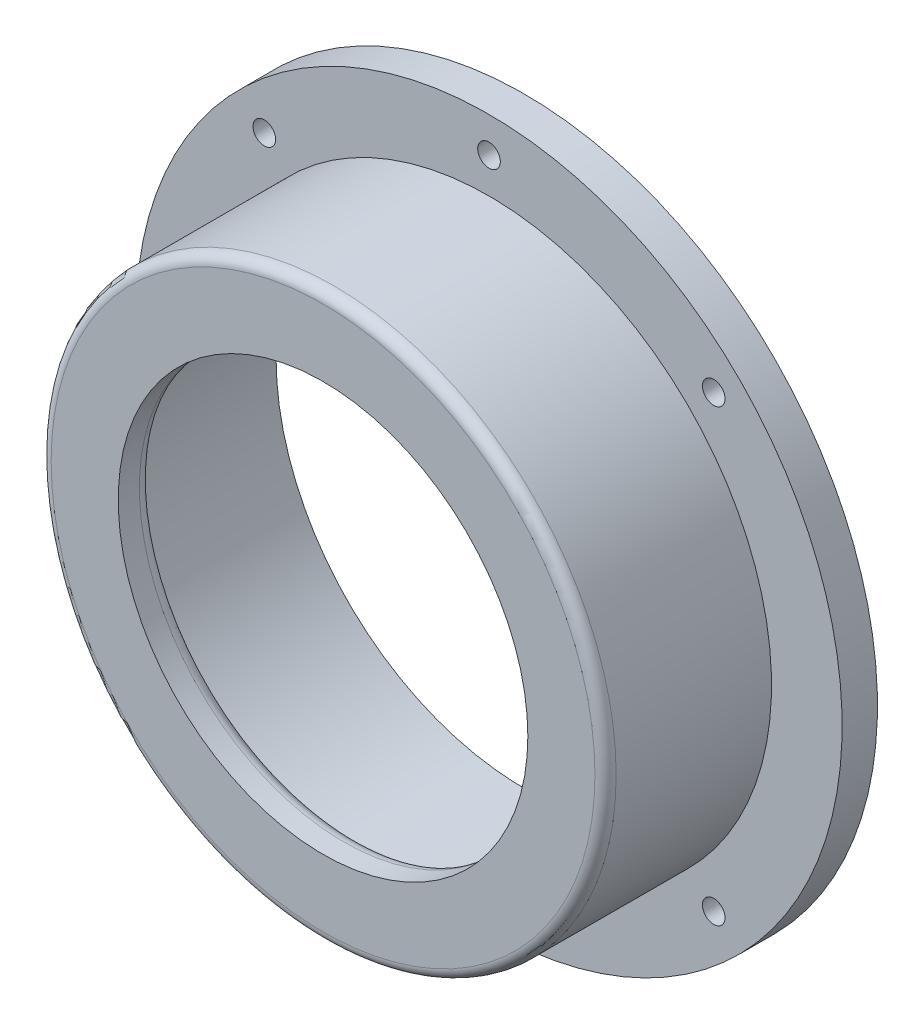
ISO-10303-21;
HEADER;
FILE_DESCRIPTION(('STEP AP214'),'2;1');
FILE_NAME('part.step','',(''),(''),'','','');
FILE_SCHEMA(('AUTOMOTIVE_DESIGN { 1 0 10303 214 1 1 1 1 }'));
ENDSEC;
DATA;
#1=APPLICATION_CONTEXT('core data for automotive mechanical design processes');
#2=APPLICATION_PROTOCOL_DEFINITION('international standard','automotive_design',2000,#1);
#3=PRODUCT_CONTEXT('',#1,'mechanical');
#4=PRODUCT('Part','Part','',(#3));
#5=PRODUCT_RELATED_PRODUCT_CATEGORY('part','',(#4));
#6=PRODUCT_DEFINITION_FORMATION('','',#4);
#7=PRODUCT_DEFINITION_CONTEXT('part definition',#1,'design');
#8=PRODUCT_DEFINITION('design','',#6,#7);
#9=PRODUCT_DEFINITION_SHAPE('','',#8);
#10=(LENGTH_UNIT() NAMED_UNIT(*) SI_UNIT(.MILLI.,.METRE.));
#11=(NAMED_UNIT(*) PLANE_ANGLE_UNIT() SI_UNIT($,.RADIAN.));
#12=(NAMED_UNIT(*) SI_UNIT($,.STERADIAN.) SOLID_ANGLE_UNIT());
#13=UNCERTAINTY_MEASURE_WITH_UNIT(LENGTH_MEASURE(1.E-05),#10,'distance_accuracy_value','');
#14=(GEOMETRIC_REPRESENTATION_CONTEXT(3) GLOBAL_UNCERTAINTY_ASSIGNED_CONTEXT((#13)) GLOBAL_UNIT_ASSIGNED_CONTEXT((#10,
#11,#12)) REPRESENTATION_CONTEXT('',''));
#15=CARTESIAN_POINT('',(0.,0.,0.));
#16=DIRECTION('',(0.,0.,1.));
#17=DIRECTION('',(1.,0.,0.));
#18=AXIS2_PLACEMENT_3D('',#15,#16,#17);
#19=CARTESIAN_POINT('',(0.,0.,28.5));
#20=DIRECTION('',(0.,0.,-1.));
#21=DIRECTION('',(-1.,0.,0.));
#22=AXIS2_PLACEMENT_3D('',#19,#20,#21);
#23=CYLINDRICAL_SURFACE('',#22,40.);
#24=CARTESIAN_POINT('',(0.,0.,27.));
#25=DIRECTION('',(0.,0.,1.));
#26=DIRECTION('',(1.,0.,0.));
#27=AXIS2_PLACEMENT_3D('',#24,#25,#26);
#28=CIRCLE('',#27,40.);
#29=CARTESIAN_POINT('',(-40.,0.,27.));
#30=VERTEX_POINT('',#29);
#31=EDGE_CURVE('E48',#30,#30,#28,.F.);
#32=CARTESIAN_POINT('',(0.,0.,5.));
#33=DIRECTION('',(0.,0.,-1.));
#34=DIRECTION('',(-1.,0.,0.));
#35=AXIS2_PLACEMENT_3D('',#32,#33,#34);
#36=CIRCLE('',#35,40.);
#37=CARTESIAN_POINT('',(-40.,0.,5.));
#38=VERTEX_POINT('',#37);
#39=EDGE_CURVE('E63',#38,#38,#36,.T.);
#40=CARTESIAN_POINT('',(-40.,0.,27.));
#41=CARTESIAN_POINT('',(-40.,0.,26.7708333333333));
#42=CARTESIAN_POINT('',(-40.,0.,26.5416666666667));
#43=CARTESIAN_POINT('',(-40.,0.,26.0833333333333));
#44=CARTESIAN_POINT('',(-40.,0.,25.8541666666667));
#45=CARTESIAN_POINT('',(-40.,0.,25.3958333333333));
#46=CARTESIAN_POINT('',(-40.,0.,25.1666666666667));
#47=CARTESIAN_POINT('',(-40.,0.,24.7083333333333));
#48=CARTESIAN_POINT('',(-40.,0.,24.4791666666667));
#49=CARTESIAN_POINT('',(-40.,0.,24.0208333333333));
#50=CARTESIAN_POINT('',(-40.,0.,23.7916666666667));
#51=CARTESIAN_POINT('',(-40.,0.,23.3333333333333));
#52=CARTESIAN_POINT('',(-40.,0.,23.1041666666667));
#53=CARTESIAN_POINT('',(-40.,0.,22.6458333333333));
#54=CARTESIAN_POINT('',(-40.,0.,22.4166666666667));
#55=CARTESIAN_POINT('',(-40.,0.,21.9583333333333));
#56=CARTESIAN_POINT('',(-40.,0.,21.7291666666667));
#57=CARTESIAN_POINT('',(-40.,0.,21.2708333333333));
#58=CARTESIAN_POINT('',(-40.,0.,21.0416666666667));
#59=CARTESIAN_POINT('',(-40.,0.,20.5833333333333));
#60=CARTESIAN_POINT('',(-40.,0.,20.3541666666667));
#61=CARTESIAN_POINT('',(-40.,0.,19.8958333333333));
#62=CARTESIAN_POINT('',(-40.,0.,19.6666666666667));
#63=CARTESIAN_POINT('',(-40.,0.,19.2083333333333));
#64=CARTESIAN_POINT('',(-40.,0.,18.9791666666667));
#65=CARTESIAN_POINT('',(-40.,0.,18.5208333333333));
#66=CARTESIAN_POINT('',(-40.,0.,18.2916666666667));
#67=CARTESIAN_POINT('',(-40.,0.,17.8333333333333));
#68=CARTESIAN_POINT('',(-40.,0.,17.6041666666667));
#69=CARTESIAN_POINT('',(-40.,0.,17.1458333333333));
#70=CARTESIAN_POINT('',(-40.,0.,16.9166666666667));
#71=CARTESIAN_POINT('',(-40.,0.,16.4583333333333));
#72=CARTESIAN_POINT('',(-40.,0.,16.2291666666667));
#73=CARTESIAN_POINT('',(-40.,0.,15.7708333333333));
#74=CARTESIAN_POINT('',(-40.,0.,15.5416666666667));
#75=CARTESIAN_POINT('',(-40.,0.,15.0833333333333));
#76=CARTESIAN_POINT('',(-40.,0.,14.8541666666667));
#77=CARTESIAN_POINT('',(-40.,0.,14.3958333333333));
#78=CARTESIAN_POINT('',(-40.,0.,14.1666666666667));
#79=CARTESIAN_POINT('',(-40.,0.,13.7083333333333));
#80=CARTESIAN_POINT('',(-40.,0.,13.4791666666667));
#81=CARTESIAN_POINT('',(-40.,0.,13.0208333333333));
#82=CARTESIAN_POINT('',(-40.,0.,12.7916666666667));
#83=CARTESIAN_POINT('',(-40.,0.,12.3333333333333));
#84=CARTESIAN_POINT('',(-40.,0.,12.1041666666667));
#85=CARTESIAN_POINT('',(-40.,0.,11.6458333333333));
#86=CARTESIAN_POINT('',(-40.,0.,11.4166666666667));
#87=CARTESIAN_POINT('',(-40.,0.,10.9583333333333));
#88=CARTESIAN_POINT('',(-40.,0.,10.7291666666667));
#89=CARTESIAN_POINT('',(-40.,0.,10.2708333333333));
#90=CARTESIAN_POINT('',(-40.,0.,10.0416666666667));
#91=CARTESIAN_POINT('',(-40.,0.,9.58333333333333));
#92=CARTESIAN_POINT('',(-40.,0.,9.35416666666667));
#93=CARTESIAN_POINT('',(-40.,0.,8.89583333333333));
#94=CARTESIAN_POINT('',(-40.,0.,8.66666666666667));
#95=CARTESIAN_POINT('',(-40.,0.,8.20833333333333));
#96=CARTESIAN_POINT('',(-40.,0.,7.97916666666667));
#97=CARTESIAN_POINT('',(-40.,0.,7.52083333333333));
#98=CARTESIAN_POINT('',(-40.,0.,7.29166666666667));
#99=CARTESIAN_POINT('',(-40.,0.,6.83333333333333));
#100=CARTESIAN_POINT('',(-40.,0.,6.60416666666667));
#101=CARTESIAN_POINT('',(-40.,0.,6.14583333333334));
#102=CARTESIAN_POINT('',(-40.,0.,5.91666666666667));
#103=CARTESIAN_POINT('',(-40.,0.,5.45833333333334));
#104=CARTESIAN_POINT('',(-40.,0.,5.22916666666667));
#105=CARTESIAN_POINT('',(-40.,0.,5.));
#106=B_SPLINE_CURVE_WITH_KNOTS('',3,(#40,#41,#42,#43,#44,#45,#46,#47,#48,#49,#50,#51,#52,#53,
#54,#55,#56,#57,#58,#59,#60,#61,#62,#63,#64,#65,#66,#67,#68,#69,#70,#71,#72,#73,#74,#75,#76,#77,
#78,#79,#80,#81,#82,#83,#84,#85,#86,#87,#88,#89,#90,#91,#92,#93,#94,#95,#96,#97,#98,#99,#100,
#101,#102,#103,#104,#105),.UNSPECIFIED.,.F.,.F.,(4,2,2,2,2,2,2,2,2,2,2,2,2,2,2,2,2,2,2,2,2,2,2,
2,2,2,2,2,2,2,2,2,4),(0.,0.687500000000001,1.375,2.0625,2.75,3.4375,4.125,4.8125,5.5,6.1875,
6.875,7.5625,8.25,8.9375,9.625,10.3125,11.,11.6875,12.375,13.0625,13.75,14.4375,15.125,15.8125,
16.5,17.1875,17.875,18.5625,19.25,19.9375,20.625,21.3125,22.),.UNSPECIFIED.);
#107=EDGE_CURVE('BSEAM37',#30,#38,#106,.T.);
#108=ORIENTED_EDGE('',*,*,#31,.T.);
#109=ORIENTED_EDGE('',*,*,#39,.F.);
#110=ORIENTED_EDGE('',*,*,#107,.T.);
#111=ORIENTED_EDGE('',*,*,#107,.F.);
#112=EDGE_LOOP('',(#108,#110,#109,#111));
#113=FACE_BOUND('',#112,.T.);
#114=ADVANCED_FACE('F37',(#113),#23,.T.);
#115=CARTESIAN_POINT('',(0.,0.,28.5));
#116=DIRECTION('',(0.,0.,-1.));
#117=DIRECTION('',(-1.,0.,0.));
#118=AXIS2_PLACEMENT_3D('',#115,#116,#117);
#119=CYLINDRICAL_SURFACE('',#118,35.15);
#120=CARTESIAN_POINT('',(0.,0.,22.));
#121=DIRECTION('',(0.,0.,1.));
#122=DIRECTION('',(1.,0.,0.));
#123=AXIS2_PLACEMENT_3D('',#120,#121,#122);
#124=CIRCLE('',#123,35.15);
#125=CARTESIAN_POINT('',(-35.15,0.,22.));
#126=VERTEX_POINT('',#125);
#127=EDGE_CURVE('E60',#126,#126,#124,.T.);
#128=CARTESIAN_POINT('',(0.,0.,0.));
#129=DIRECTION('',(0.,0.,1.));
#130=DIRECTION('',(1.,0.,0.));
#131=AXIS2_PLACEMENT_3D('',#128,#129,#130);
#132=CIRCLE('',#131,35.15);
#133=CARTESIAN_POINT('',(-35.15,0.,0.));
#134=VERTEX_POINT('',#133);
#135=EDGE_CURVE('E66',#134,#134,#132,.T.);
#136=CARTESIAN_POINT('',(-35.15,0.,22.));
#137=CARTESIAN_POINT('',(-35.15,0.,21.7708333333333));
#138=CARTESIAN_POINT('',(-35.15,0.,21.5416666666667));
#139=CARTESIAN_POINT('',(-35.15,0.,21.0833333333333));
#140=CARTESIAN_POINT('',(-35.15,0.,20.8541666666667));
#141=CARTESIAN_POINT('',(-35.15,0.,20.3958333333333));
#142=CARTESIAN_POINT('',(-35.15,0.,20.1666666666667));
#143=CARTESIAN_POINT('',(-35.15,0.,19.7083333333333));
#144=CARTESIAN_POINT('',(-35.15,0.,19.4791666666667));
#145=CARTESIAN_POINT('',(-35.15,0.,19.0208333333333));
#146=CARTESIAN_POINT('',(-35.15,0.,18.7916666666667));
#147=CARTESIAN_POINT('',(-35.15,0.,18.3333333333333));
#148=CARTESIAN_POINT('',(-35.15,0.,18.1041666666667));
#149=CARTESIAN_POINT('',(-35.15,0.,17.6458333333333));
#150=CARTESIAN_POINT('',(-35.15,0.,17.4166666666667));
#151=CARTESIAN_POINT('',(-35.15,0.,16.9583333333333));
#152=CARTESIAN_POINT('',(-35.15,0.,16.7291666666667));
#153=CARTESIAN_POINT('',(-35.15,0.,16.2708333333333));
#154=CARTESIAN_POINT('',(-35.15,0.,16.0416666666667));
#155=CARTESIAN_POINT('',(-35.15,0.,15.5833333333333));
#156=CARTESIAN_POINT('',(-35.15,0.,15.3541666666667));
#157=CARTESIAN_POINT('',(-35.15,0.,14.8958333333333));
#158=CARTESIAN_POINT('',(-35.15,0.,14.6666666666667));
#159=CARTESIAN_POINT('',(-35.15,0.,14.2083333333333));
#160=CARTESIAN_POINT('',(-35.15,0.,13.9791666666667));
#161=CARTESIAN_POINT('',(-35.15,0.,13.5208333333333));
#162=CARTESIAN_POINT('',(-35.15,0.,13.2916666666667));
#163=CARTESIAN_POINT('',(-35.15,0.,12.8333333333333));
#164=CARTESIAN_POINT('',(-35.15,0.,12.6041666666667));
#165=CARTESIAN_POINT('',(-35.15,0.,12.1458333333333));
#166=CARTESIAN_POINT('',(-35.15,0.,11.9166666666667));
#167=CARTESIAN_POINT('',(-35.15,0.,11.4583333333333));
#168=CARTESIAN_POINT('',(-35.15,0.,11.2291666666667));
#169=CARTESIAN_POINT('',(-35.15,0.,10.7708333333333));
#170=CARTESIAN_POINT('',(-35.15,0.,10.5416666666667));
#171=CARTESIAN_POINT('',(-35.15,0.,10.0833333333333));
#172=CARTESIAN_POINT('',(-35.15,0.,9.85416666666667));
#173=CARTESIAN_POINT('',(-35.15,0.,9.39583333333333));
#174=CARTESIAN_POINT('',(-35.15,0.,9.16666666666667));
#175=CARTESIAN_POINT('',(-35.15,0.,8.70833333333333));
#176=CARTESIAN_POINT('',(-35.15,0.,8.47916666666667));
#177=CARTESIAN_POINT('',(-35.15,0.,8.02083333333333));
#178=CARTESIAN_POINT('',(-35.15,0.,7.79166666666667));
#179=CARTESIAN_POINT('',(-35.15,0.,7.33333333333333));
#180=CARTESIAN_POINT('',(-35.15,0.,7.10416666666667));
#181=CARTESIAN_POINT('',(-35.15,0.,6.64583333333333));
#182=CARTESIAN_POINT('',(-35.15,0.,6.41666666666667));
#183=CARTESIAN_POINT('',(-35.15,0.,5.95833333333333));
#184=CARTESIAN_POINT('',(-35.15,0.,5.72916666666666));
#185=CARTESIAN_POINT('',(-35.15,0.,5.27083333333333));
#186=CARTESIAN_POINT('',(-35.15,0.,5.04166666666667));
#187=CARTESIAN_POINT('',(-35.15,0.,4.58333333333333));
#188=CARTESIAN_POINT('',(-35.15,0.,4.35416666666667));
#189=CARTESIAN_POINT('',(-35.15,0.,3.89583333333333));
#190=CARTESIAN_POINT('',(-35.15,0.,3.66666666666667));
#191=CARTESIAN_POINT('',(-35.15,0.,3.20833333333333));
#192=CARTESIAN_POINT('',(-35.15,0.,2.97916666666667));
#193=CARTESIAN_POINT('',(-35.15,0.,2.52083333333333));
#194=CARTESIAN_POINT('',(-35.15,0.,2.29166666666667));
#195=CARTESIAN_POINT('',(-35.15,0.,1.83333333333333));
#196=CARTESIAN_POINT('',(-35.15,0.,1.60416666666667));
#197=CARTESIAN_POINT('',(-35.15,0.,1.14583333333333));
#198=CARTESIAN_POINT('',(-35.15,0.,0.916666666666667));
#199=CARTESIAN_POINT('',(-35.15,0.,0.458333333333334));
#200=CARTESIAN_POINT('',(-35.15,0.,0.229166666666667));
#201=CARTESIAN_POINT('',(-35.15,0.,0.));
#202=B_SPLINE_CURVE_WITH_KNOTS('',3,(#136,#137,#138,#139,#140,#141,#142,#143,#144,#145,#146,
#147,#148,#149,#150,#151,#152,#153,#154,#155,#156,#157,#158,#159,#160,#161,#162,#163,#164,#165,
#166,#167,#168,#169,#170,#171,#172,#173,#174,#175,#176,#177,#178,#179,#180,#181,#182,#183,#184,
#185,#186,#187,#188,#189,#190,#191,#192,#193,#194,#195,#196,#197,#198,#199,#200,#201),
.UNSPECIFIED.,.F.,.F.,(4,2,2,2,2,2,2,2,2,2,2,2,2,2,2,2,2,2,2,2,2,2,2,2,2,2,2,2,2,2,2,2,4),(0.,
0.687499999999997,1.375,2.0625,2.75,3.4375,4.125,4.8125,5.5,6.18749999999999,6.875,7.5625,8.25,
8.9375,9.625,10.3125,11.,11.6875,12.375,13.0625,13.75,14.4375,15.125,15.8125,16.5,17.1875,
17.875,18.5625,19.25,19.9375,20.625,21.3125,22.),.UNSPECIFIED.);
#203=EDGE_CURVE('BSEAM147',#126,#134,#202,.T.);
#204=ORIENTED_EDGE('',*,*,#127,.T.);
#205=ORIENTED_EDGE('',*,*,#135,.F.);
#206=ORIENTED_EDGE('',*,*,#203,.T.);
#207=ORIENTED_EDGE('',*,*,#203,.F.);
#208=EDGE_LOOP('',(#204,#206,#205,#207));
#209=FACE_BOUND('',#208,.T.);
#210=ADVANCED_FACE('F147',(#209),#119,.F.);
#211=CARTESIAN_POINT('',(0.,0.,28.5));
#212=DIRECTION('',(0.,0.,1.));
#213=DIRECTION('',(1.,0.,0.));
#214=AXIS2_PLACEMENT_3D('',#211,#212,#213);
#215=PLANE('',#214);
#216=CARTESIAN_POINT('',(0.,0.,28.5));
#217=DIRECTION('',(0.,0.,1.));
#218=DIRECTION('',(1.,0.,0.));
#219=AXIS2_PLACEMENT_3D('',#216,#217,#218);
#220=CIRCLE('',#219,38.5);
#221=CARTESIAN_POINT('',(38.5,0.,28.5));
#222=VERTEX_POINT('',#221);
#223=EDGE_CURVE('E52',#222,#222,#220,.T.);
#224=ORIENTED_EDGE('',*,*,#223,.T.);
#225=EDGE_LOOP('',(#224));
#226=FACE_BOUND('',#225,.T.);
#227=CARTESIAN_POINT('',(0.,0.,28.5));
#228=DIRECTION('',(0.,0.,1.));
#229=DIRECTION('',(1.,0.,0.));
#230=AXIS2_PLACEMENT_3D('',#227,#228,#229);
#231=CIRCLE('',#230,29.);
#232=CARTESIAN_POINT('',(29.,0.,28.5));
#233=VERTEX_POINT('',#232);
#234=EDGE_CURVE('E69',#233,#233,#231,.T.);
#235=ORIENTED_EDGE('',*,*,#234,.F.);
#236=EDGE_LOOP('',(#235));
#237=FACE_BOUND('',#236,.T.);
#238=ADVANCED_FACE('F139',(#226,#237),#215,.T.);
#239=CARTESIAN_POINT('',(0.,0.,0.));
#240=DIRECTION('',(0.,0.,1.));
#241=DIRECTION('',(1.,0.,0.));
#242=AXIS2_PLACEMENT_3D('',#239,#240,#241);
#243=PLANE('',#242);
#244=CARTESIAN_POINT('',(0.,45.,0.));
#245=DIRECTION('',(0.,0.,1.));
#246=DIRECTION('',(1.,0.,0.));
#247=AXIS2_PLACEMENT_3D('',#244,#245,#246);
#248=CIRCLE('',#247,1.6);
#249=CARTESIAN_POINT('',(1.6,45.,0.));
#250=VERTEX_POINT('',#249);
#251=EDGE_CURVE('E85',#250,#250,#248,.T.);
#252=ORIENTED_EDGE('',*,*,#251,.T.);
#253=EDGE_LOOP('',(#252));
#254=FACE_BOUND('',#253,.T.);
#255=CARTESIAN_POINT('',(-31.8198051533941,31.8198051533951,0.));
#256=DIRECTION('',(0.,0.,1.));
#257=DIRECTION('',(1.,0.,0.));
#258=AXIS2_PLACEMENT_3D('',#255,#256,#257);
#259=CIRCLE('',#258,1.6);
#260=CARTESIAN_POINT('',(-30.2198051533941,31.8198051533951,0.));
#261=VERTEX_POINT('',#260);
#262=EDGE_CURVE('E91',#261,#261,#259,.T.);
#263=ORIENTED_EDGE('',*,*,#262,.T.);
#264=EDGE_LOOP('',(#263));
#265=FACE_BOUND('',#264,.T.);
#266=CARTESIAN_POINT('',(-31.819805153395,-31.8198051533942,0.));
#267=DIRECTION('',(0.,0.,1.));
#268=DIRECTION('',(1.,0.,0.));
#269=AXIS2_PLACEMENT_3D('',#266,#267,#268);
#270=CIRCLE('',#269,1.59999999999999);
#271=CARTESIAN_POINT('',(-30.219805153395,-31.8198051533942,0.));
#272=VERTEX_POINT('',#271);
#273=EDGE_CURVE('E97',#272,#272,#270,.T.);
#274=ORIENTED_EDGE('',*,*,#273,.T.);
#275=EDGE_LOOP('',(#274));
#276=FACE_BOUND('',#275,.T.);
#277=CARTESIAN_POINT('',(31.8198051533944,-31.8198051533949,0.));
#278=DIRECTION('',(0.,0.,1.));
#279=DIRECTION('',(1.,0.,0.));
#280=AXIS2_PLACEMENT_3D('',#277,#278,#279);
#281=CIRCLE('',#280,1.6);
#282=CARTESIAN_POINT('',(33.4198051533943,-31.8198051533949,0.));
#283=VERTEX_POINT('',#282);
#284=EDGE_CURVE('E103',#283,#283,#281,.T.);
#285=ORIENTED_EDGE('',*,*,#284,.T.);
#286=EDGE_LOOP('',(#285));
#287=FACE_BOUND('',#286,.T.);
#288=CARTESIAN_POINT('',(0.,-45.,0.));
#289=DIRECTION('',(0.,0.,1.));
#290=DIRECTION('',(1.,0.,0.));
#291=AXIS2_PLACEMENT_3D('',#288,#289,#290);
#292=CIRCLE('',#291,1.6);
#293=CARTESIAN_POINT('',(1.6,-45.,0.));
#294=VERTEX_POINT('',#293);
#295=EDGE_CURVE('E109',#294,#294,#292,.T.);
#296=ORIENTED_EDGE('',*,*,#295,.T.);
#297=EDGE_LOOP('',(#296));
#298=FACE_BOUND('',#297,.T.);
#299=CARTESIAN_POINT('',(31.8198051533948,31.8198051533945,0.));
#300=DIRECTION('',(0.,0.,1.));
#301=DIRECTION('',(1.,0.,0.));
#302=AXIS2_PLACEMENT_3D('',#299,#300,#301);
#303=CIRCLE('',#302,1.6);
#304=CARTESIAN_POINT('',(33.4198051533948,31.8198051533945,0.));
#305=VERTEX_POINT('',#304);
#306=EDGE_CURVE('E76',#305,#305,#303,.T.);
#307=ORIENTED_EDGE('',*,*,#306,.T.);
#308=EDGE_LOOP('',(#307));
#309=FACE_BOUND('',#308,.T.);
#310=ORIENTED_EDGE('',*,*,#135,.T.);
#311=EDGE_LOOP('',(#310));
#312=FACE_BOUND('',#311,.T.);
#313=CARTESIAN_POINT('',(0.,0.,0.));
#314=DIRECTION('',(0.,0.,-1.));
#315=DIRECTION('',(-1.,0.,0.));
#316=AXIS2_PLACEMENT_3D('',#313,#314,#315);
#317=CIRCLE('',#316,50.);
#318=CARTESIAN_POINT('',(-50.,0.,0.));
#319=VERTEX_POINT('',#318);
#320=EDGE_CURVE('E73',#319,#319,#317,.T.);
#321=ORIENTED_EDGE('',*,*,#320,.T.);
#322=EDGE_LOOP('',(#321));
#323=FACE_BOUND('',#322,.T.);
#324=ADVANCED_FACE('F136',(#254,#265,#276,#287,#298,#309,#312,#323),#243,.F.);
#325=CARTESIAN_POINT('',(0.,0.,23.5));
#326=DIRECTION('',(0.,0.,1.));
#327=DIRECTION('',(1.,0.,0.));
#328=AXIS2_PLACEMENT_3D('',#325,#326,#327);
#329=PLANE('',#328);
#330=CARTESIAN_POINT('',(0.,0.,23.5));
#331=DIRECTION('',(0.,0.,1.));
#332=DIRECTION('',(1.,0.,0.));
#333=AXIS2_PLACEMENT_3D('',#330,#331,#332);
#334=CIRCLE('',#333,31.);
#335=CARTESIAN_POINT('',(31.,0.,23.5));
#336=VERTEX_POINT('',#335);
#337=EDGE_CURVE('E44',#336,#336,#334,.T.);
#338=ORIENTED_EDGE('',*,*,#337,.T.);
#339=EDGE_LOOP('',(#338));
#340=FACE_BOUND('',#339,.T.);
#341=CARTESIAN_POINT('',(0.,0.,23.5));
#342=DIRECTION('',(0.,0.,1.));
#343=DIRECTION('',(1.,0.,0.));
#344=AXIS2_PLACEMENT_3D('',#341,#342,#343);
#345=CIRCLE('',#344,33.65);
#346=CARTESIAN_POINT('',(33.65,0.,23.5));
#347=VERTEX_POINT('',#346);
#348=EDGE_CURVE('E57',#347,#347,#345,.F.);
#349=ORIENTED_EDGE('',*,*,#348,.T.);
#350=EDGE_LOOP('',(#349));
#351=FACE_BOUND('',#350,.T.);
#352=ADVANCED_FACE('F138',(#340,#351),#329,.F.);
#353=CARTESIAN_POINT('',(0.,0.,23.5));
#354=DIRECTION('',(0.,0.,1.));
#355=DIRECTION('',(1.,0.,0.));
#356=AXIS2_PLACEMENT_3D('',#353,#354,#355);
#357=CYLINDRICAL_SURFACE('',#356,29.);
#358=CARTESIAN_POINT('',(0.,0.,25.5));
#359=DIRECTION('',(0.,0.,1.));
#360=DIRECTION('',(1.,0.,0.));
#361=AXIS2_PLACEMENT_3D('',#358,#359,#360);
#362=CIRCLE('',#361,29.);
#363=CARTESIAN_POINT('',(29.,0.,25.5));
#364=VERTEX_POINT('',#363);
#365=EDGE_CURVE('E10',#364,#364,#362,.F.);
#366=ORIENTED_EDGE('',*,*,#365,.T.);
#367=EDGE_LOOP('',(#366));
#368=FACE_BOUND('',#367,.T.);
#369=ORIENTED_EDGE('',*,*,#234,.T.);
#370=EDGE_LOOP('',(#369));
#371=FACE_BOUND('',#370,.T.);
#372=ADVANCED_FACE('F132',(#368,#371),#357,.F.);
#373=CARTESIAN_POINT('',(0.,0.,5.));
#374=DIRECTION('',(0.,0.,-1.));
#375=DIRECTION('',(-1.,0.,0.));
#376=AXIS2_PLACEMENT_3D('',#373,#374,#375);
#377=CYLINDRICAL_SURFACE('',#376,50.);
#378=CARTESIAN_POINT('',(0.,0.,5.));
#379=DIRECTION('',(0.,0.,-1.));
#380=DIRECTION('',(-1.,0.,0.));
#381=AXIS2_PLACEMENT_3D('',#378,#379,#380);
#382=CIRCLE('',#381,50.);
#383=CARTESIAN_POINT('',(-50.,0.,5.));
#384=VERTEX_POINT('',#383);
#385=EDGE_CURVE('E72',#384,#384,#382,.T.);
#386=ORIENTED_EDGE('',*,*,#385,.T.);
#387=EDGE_LOOP('',(#386));
#388=FACE_BOUND('',#387,.T.);
#389=ORIENTED_EDGE('',*,*,#320,.F.);
#390=EDGE_LOOP('',(#389));
#391=FACE_BOUND('',#390,.T.);
#392=ADVANCED_FACE('F121',(#388,#391),#377,.T.);
#393=CARTESIAN_POINT('',(0.,0.,5.));
#394=DIRECTION('',(0.,0.,-1.));
#395=DIRECTION('',(-1.,0.,0.));
#396=AXIS2_PLACEMENT_3D('',#393,#394,#395);
#397=PLANE('',#396);
#398=CARTESIAN_POINT('',(0.,45.,5.));
#399=DIRECTION('',(0.,0.,1.));
#400=DIRECTION('',(1.,0.,0.));
#401=AXIS2_PLACEMENT_3D('',#398,#399,#400);
#402=CIRCLE('',#401,1.6);
#403=CARTESIAN_POINT('',(1.6,45.,5.));
#404=VERTEX_POINT('',#403);
#405=EDGE_CURVE('E88',#404,#404,#402,.T.);
#406=ORIENTED_EDGE('',*,*,#405,.F.);
#407=EDGE_LOOP('',(#406));
#408=FACE_BOUND('',#407,.T.);
#409=CARTESIAN_POINT('',(-31.8198051533941,31.8198051533951,5.));
#410=DIRECTION('',(0.,0.,1.));
#411=DIRECTION('',(1.,0.,0.));
#412=AXIS2_PLACEMENT_3D('',#409,#410,#411);
#413=CIRCLE('',#412,1.6);
#414=CARTESIAN_POINT('',(-30.2198051533941,31.8198051533951,5.));
#415=VERTEX_POINT('',#414);
#416=EDGE_CURVE('E94',#415,#415,#413,.T.);
#417=ORIENTED_EDGE('',*,*,#416,.F.);
#418=EDGE_LOOP('',(#417));
#419=FACE_BOUND('',#418,.T.);
#420=CARTESIAN_POINT('',(-31.819805153395,-31.8198051533942,5.));
#421=DIRECTION('',(0.,0.,1.));
#422=DIRECTION('',(1.,0.,0.));
#423=AXIS2_PLACEMENT_3D('',#420,#421,#422);
#424=CIRCLE('',#423,1.59999999999999);
#425=CARTESIAN_POINT('',(-30.219805153395,-31.8198051533942,5.));
#426=VERTEX_POINT('',#425);
#427=EDGE_CURVE('E100',#426,#426,#424,.T.);
#428=ORIENTED_EDGE('',*,*,#427,.F.);
#429=EDGE_LOOP('',(#428));
#430=FACE_BOUND('',#429,.T.);
#431=CARTESIAN_POINT('',(31.8198051533944,-31.8198051533949,5.));
#432=DIRECTION('',(0.,0.,1.));
#433=DIRECTION('',(1.,0.,0.));
#434=AXIS2_PLACEMENT_3D('',#431,#432,#433);
#435=CIRCLE('',#434,1.6);
#436=CARTESIAN_POINT('',(33.4198051533943,-31.8198051533949,5.));
#437=VERTEX_POINT('',#436);
#438=EDGE_CURVE('E106',#437,#437,#435,.T.);
#439=ORIENTED_EDGE('',*,*,#438,.F.);
#440=EDGE_LOOP('',(#439));
#441=FACE_BOUND('',#440,.T.);
#442=CARTESIAN_POINT('',(0.,-45.,5.));
#443=DIRECTION('',(0.,0.,1.));
#444=DIRECTION('',(1.,0.,0.));
#445=AXIS2_PLACEMENT_3D('',#442,#443,#444);
#446=CIRCLE('',#445,1.6);
#447=CARTESIAN_POINT('',(1.6,-45.,5.));
#448=VERTEX_POINT('',#447);
#449=EDGE_CURVE('E82',#448,#448,#446,.T.);
#450=ORIENTED_EDGE('',*,*,#449,.F.);
#451=EDGE_LOOP('',(#450));
#452=FACE_BOUND('',#451,.T.);
#453=CARTESIAN_POINT('',(31.8198051533948,31.8198051533945,5.));
#454=DIRECTION('',(0.,0.,1.));
#455=DIRECTION('',(1.,0.,0.));
#456=AXIS2_PLACEMENT_3D('',#453,#454,#455);
#457=CIRCLE('',#456,1.6);
#458=CARTESIAN_POINT('',(33.4198051533948,31.8198051533945,5.));
#459=VERTEX_POINT('',#458);
#460=EDGE_CURVE('E79',#459,#459,#457,.T.);
#461=ORIENTED_EDGE('',*,*,#460,.F.);
#462=EDGE_LOOP('',(#461));
#463=FACE_BOUND('',#462,.T.);
#464=ORIENTED_EDGE('',*,*,#39,.T.);
#465=EDGE_LOOP('',(#464));
#466=FACE_BOUND('',#465,.T.);
#467=ORIENTED_EDGE('',*,*,#385,.F.);
#468=EDGE_LOOP('',(#467));
#469=FACE_BOUND('',#468,.T.);
#470=ADVANCED_FACE('F117',(#408,#419,#430,#441,#452,#463,#466,#469),#397,.F.);
#471=CARTESIAN_POINT('',(31.8198051533948,31.8198051533945,0.));
#472=DIRECTION('',(0.,0.,1.));
#473=DIRECTION('',(1.,0.,0.));
#474=AXIS2_PLACEMENT_3D('',#471,#472,#473);
#475=CYLINDRICAL_SURFACE('',#474,1.6);
#476=ORIENTED_EDGE('',*,*,#306,.F.);
#477=EDGE_LOOP('',(#476));
#478=FACE_BOUND('',#477,.T.);
#479=ORIENTED_EDGE('',*,*,#460,.T.);
#480=EDGE_LOOP('',(#479));
#481=FACE_BOUND('',#480,.T.);
#482=ADVANCED_FACE('F120',(#478,#481),#475,.F.);
#483=CARTESIAN_POINT('',(0.,-45.,0.));
#484=DIRECTION('',(0.,0.,1.));
#485=DIRECTION('',(1.,0.,0.));
#486=AXIS2_PLACEMENT_3D('',#483,#484,#485);
#487=CYLINDRICAL_SURFACE('',#486,1.6);
#488=ORIENTED_EDGE('',*,*,#295,.F.);
#489=EDGE_LOOP('',(#488));
#490=FACE_BOUND('',#489,.T.);
#491=ORIENTED_EDGE('',*,*,#449,.T.);
#492=EDGE_LOOP('',(#491));
#493=FACE_BOUND('',#492,.T.);
#494=ADVANCED_FACE('F115',(#490,#493),#487,.F.);
#495=CARTESIAN_POINT('',(31.8198051533944,-31.8198051533949,0.));
#496=DIRECTION('',(0.,0.,1.));
#497=DIRECTION('',(1.,0.,0.));
#498=AXIS2_PLACEMENT_3D('',#495,#496,#497);
#499=CYLINDRICAL_SURFACE('',#498,1.6);
#500=ORIENTED_EDGE('',*,*,#284,.F.);
#501=EDGE_LOOP('',(#500));
#502=FACE_BOUND('',#501,.T.);
#503=ORIENTED_EDGE('',*,*,#438,.T.);
#504=EDGE_LOOP('',(#503));
#505=FACE_BOUND('',#504,.T.);
#506=ADVANCED_FACE('F196',(#502,#505),#499,.F.);
#507=CARTESIAN_POINT('',(-31.819805153395,-31.8198051533942,0.));
#508=DIRECTION('',(0.,0.,1.));
#509=DIRECTION('',(1.,0.,0.));
#510=AXIS2_PLACEMENT_3D('',#507,#508,#509);
#511=CYLINDRICAL_SURFACE('',#510,1.59999999999999);
#512=ORIENTED_EDGE('',*,*,#273,.F.);
#513=EDGE_LOOP('',(#512));
#514=FACE_BOUND('',#513,.T.);
#515=ORIENTED_EDGE('',*,*,#427,.T.);
#516=EDGE_LOOP('',(#515));
#517=FACE_BOUND('',#516,.T.);
#518=ADVANCED_FACE('F192',(#514,#517),#511,.F.);
#519=CARTESIAN_POINT('',(-31.8198051533941,31.8198051533951,0.));
#520=DIRECTION('',(0.,0.,1.));
#521=DIRECTION('',(1.,0.,0.));
#522=AXIS2_PLACEMENT_3D('',#519,#520,#521);
#523=CYLINDRICAL_SURFACE('',#522,1.6);
#524=ORIENTED_EDGE('',*,*,#262,.F.);
#525=EDGE_LOOP('',(#524));
#526=FACE_BOUND('',#525,.T.);
#527=ORIENTED_EDGE('',*,*,#416,.T.);
#528=EDGE_LOOP('',(#527));
#529=FACE_BOUND('',#528,.T.);
#530=ADVANCED_FACE('F188',(#526,#529),#523,.F.);
#531=CARTESIAN_POINT('',(0.,45.,0.));
#532=DIRECTION('',(0.,0.,1.));
#533=DIRECTION('',(1.,0.,0.));
#534=AXIS2_PLACEMENT_3D('',#531,#532,#533);
#535=CYLINDRICAL_SURFACE('',#534,1.6);
#536=ORIENTED_EDGE('',*,*,#251,.F.);
#537=EDGE_LOOP('',(#536));
#538=FACE_BOUND('',#537,.T.);
#539=ORIENTED_EDGE('',*,*,#405,.T.);
#540=EDGE_LOOP('',(#539));
#541=FACE_BOUND('',#540,.T.);
#542=ADVANCED_FACE('F165',(#538,#541),#535,.F.);
#543=CARTESIAN_POINT('',(0.,0.,22.));
#544=DIRECTION('',(0.,0.,1.));
#545=DIRECTION('',(1.,0.,0.));
#546=AXIS2_PLACEMENT_3D('',#543,#544,#545);
#547=TOROIDAL_SURFACE('',#546,33.65,1.5);
#548=ORIENTED_EDGE('',*,*,#348,.F.);
#549=EDGE_LOOP('',(#548));
#550=FACE_BOUND('',#549,.T.);
#551=ORIENTED_EDGE('',*,*,#127,.F.);
#552=EDGE_LOOP('',(#551));
#553=FACE_BOUND('',#552,.T.);
#554=ADVANCED_FACE('F162',(#550,#553),#547,.F.);
#555=CARTESIAN_POINT('',(0.,0.,27.));
#556=DIRECTION('',(0.,0.,1.));
#557=DIRECTION('',(1.,0.,0.));
#558=AXIS2_PLACEMENT_3D('',#555,#556,#557);
#559=TOROIDAL_SURFACE('',#558,38.5,1.5);
#560=ORIENTED_EDGE('',*,*,#31,.F.);
#561=EDGE_LOOP('',(#560));
#562=FACE_BOUND('',#561,.T.);
#563=ORIENTED_EDGE('',*,*,#223,.F.);
#564=EDGE_LOOP('',(#563));
#565=FACE_BOUND('',#564,.T.);
#566=ADVANCED_FACE('F164',(#562,#565),#559,.T.);
#567=CARTESIAN_POINT('',(0.,0.,25.5));
#568=DIRECTION('',(0.,0.,1.));
#569=DIRECTION('',(1.,0.,0.));
#570=AXIS2_PLACEMENT_3D('',#567,#568,#569);
#571=TOROIDAL_SURFACE('',#570,31.,2.);
#572=ORIENTED_EDGE('',*,*,#365,.F.);
#573=EDGE_LOOP('',(#572));
#574=FACE_BOUND('',#573,.T.);
#575=ORIENTED_EDGE('',*,*,#337,.F.);
#576=EDGE_LOOP('',(#575));
#577=FACE_BOUND('',#576,.T.);
#578=ADVANCED_FACE('F39',(#574,#577),#571,.T.);
#579=CLOSED_SHELL('',(#114,#210,#238,#324,#352,#372,#392,#470,#482,#494,#506,#518,#530,#542,
#554,#566,#578));
#580=MANIFOLD_SOLID_BREP('B2',#579);
#581=ADVANCED_BREP_SHAPE_REPRESENTATION('',(#18,#580),#14);
#582=SHAPE_DEFINITION_REPRESENTATION(#9,#581);
ENDSEC;
END-ISO-10303-21;
